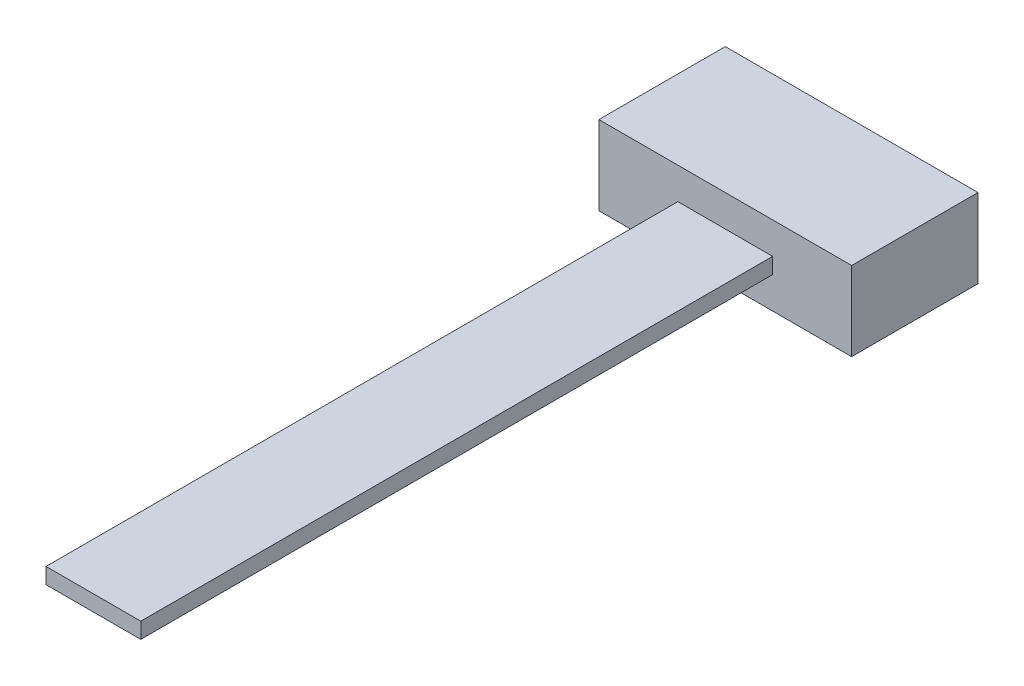
ISO-10303-21;
HEADER;
FILE_DESCRIPTION(('STEP AP214'),'2;1');
FILE_NAME('part.step','',(''),(''),'','','');
FILE_SCHEMA(('AUTOMOTIVE_DESIGN { 1 0 10303 214 1 1 1 1 }'));
ENDSEC;
DATA;
#1=APPLICATION_CONTEXT('core data for automotive mechanical design processes');
#2=APPLICATION_PROTOCOL_DEFINITION('international standard','automotive_design',2000,#1);
#3=PRODUCT_CONTEXT('',#1,'mechanical');
#4=PRODUCT('Part','Part','',(#3));
#5=PRODUCT_RELATED_PRODUCT_CATEGORY('part','',(#4));
#6=PRODUCT_DEFINITION_FORMATION('','',#4);
#7=PRODUCT_DEFINITION_CONTEXT('part definition',#1,'design');
#8=PRODUCT_DEFINITION('design','',#6,#7);
#9=PRODUCT_DEFINITION_SHAPE('','',#8);
#10=(LENGTH_UNIT() NAMED_UNIT(*) SI_UNIT(.MILLI.,.METRE.));
#11=(NAMED_UNIT(*) PLANE_ANGLE_UNIT() SI_UNIT($,.RADIAN.));
#12=(NAMED_UNIT(*) SI_UNIT($,.STERADIAN.) SOLID_ANGLE_UNIT());
#13=UNCERTAINTY_MEASURE_WITH_UNIT(LENGTH_MEASURE(1.E-05),#10,'distance_accuracy_value','');
#14=(GEOMETRIC_REPRESENTATION_CONTEXT(3) GLOBAL_UNCERTAINTY_ASSIGNED_CONTEXT((#13)) GLOBAL_UNIT_ASSIGNED_CONTEXT((#10,
#11,#12)) REPRESENTATION_CONTEXT('',''));
#15=CARTESIAN_POINT('',(0.,0.,0.));
#16=DIRECTION('',(0.,0.,1.));
#17=DIRECTION('',(1.,0.,0.));
#18=AXIS2_PLACEMENT_3D('',#15,#16,#17);
#19=CARTESIAN_POINT('',(-15.,-2.5,200.));
#20=DIRECTION('',(1.,0.,0.));
#21=DIRECTION('',(0.,0.,-1.));
#22=AXIS2_PLACEMENT_3D('',#19,#20,#21);
#23=PLANE('',#22);
#24=DIRECTION('',(0.,-1.,0.));
#25=VECTOR('',#24,1.);
#26=CARTESIAN_POINT('',(-15.,-2.5,0.));
#27=LINE('',#26,#25);
#28=CARTESIAN_POINT('',(-15.,2.5,0.));
#29=VERTEX_POINT('',#28);
#30=CARTESIAN_POINT('',(-15.,-2.5,0.));
#31=VERTEX_POINT('',#30);
#32=EDGE_CURVE('E132',#29,#31,#27,.T.);
#33=ORIENTED_EDGE('',*,*,#32,.T.);
#34=DIRECTION('',(0.,0.,-1.));
#35=VECTOR('',#34,1.);
#36=CARTESIAN_POINT('',(-15.,-2.5,200.));
#37=LINE('',#36,#35);
#38=CARTESIAN_POINT('',(-15.,-2.5,200.));
#39=VERTEX_POINT('',#38);
#40=EDGE_CURVE('E11',#39,#31,#37,.T.);
#41=ORIENTED_EDGE('',*,*,#40,.F.);
#42=DIRECTION('',(0.,-1.,0.));
#43=VECTOR('',#42,1.);
#44=CARTESIAN_POINT('',(-15.,-2.5,200.));
#45=LINE('',#44,#43);
#46=CARTESIAN_POINT('',(-15.,2.5,200.));
#47=VERTEX_POINT('',#46);
#48=EDGE_CURVE('E136',#47,#39,#45,.T.);
#49=ORIENTED_EDGE('',*,*,#48,.F.);
#50=DIRECTION('',(0.,0.,-1.));
#51=VECTOR('',#50,1.);
#52=CARTESIAN_POINT('',(-15.,2.5,200.));
#53=LINE('',#52,#51);
#54=EDGE_CURVE('E144',#47,#29,#53,.T.);
#55=ORIENTED_EDGE('',*,*,#54,.T.);
#56=EDGE_LOOP('',(#33,#41,#49,#55));
#57=FACE_BOUND('',#56,.T.);
#58=ADVANCED_FACE('F33',(#57),#23,.F.);
#59=CARTESIAN_POINT('',(-15.,-2.5,200.));
#60=DIRECTION('',(0.,1.,0.));
#61=DIRECTION('',(0.,0.,1.));
#62=AXIS2_PLACEMENT_3D('',#59,#60,#61);
#63=PLANE('',#62);
#64=DIRECTION('',(1.,0.,0.));
#65=VECTOR('',#64,1.);
#66=CARTESIAN_POINT('',(-15.,-2.5,0.));
#67=LINE('',#66,#65);
#68=CARTESIAN_POINT('',(15.,-2.5,0.));
#69=VERTEX_POINT('',#68);
#70=EDGE_CURVE('E147',#31,#69,#67,.T.);
#71=ORIENTED_EDGE('',*,*,#70,.T.);
#72=DIRECTION('',(0.,0.,-1.));
#73=VECTOR('',#72,1.);
#74=CARTESIAN_POINT('',(15.,-2.5,200.));
#75=LINE('',#74,#73);
#76=CARTESIAN_POINT('',(15.,-2.5,200.));
#77=VERTEX_POINT('',#76);
#78=EDGE_CURVE('E41',#77,#69,#75,.T.);
#79=ORIENTED_EDGE('',*,*,#78,.F.);
#80=DIRECTION('',(1.,0.,0.));
#81=VECTOR('',#80,1.);
#82=CARTESIAN_POINT('',(-15.,-2.5,200.));
#83=LINE('',#82,#81);
#84=EDGE_CURVE('E138',#39,#77,#83,.T.);
#85=ORIENTED_EDGE('',*,*,#84,.F.);
#86=ORIENTED_EDGE('',*,*,#40,.T.);
#87=EDGE_LOOP('',(#71,#79,#85,#86));
#88=FACE_BOUND('',#87,.T.);
#89=ADVANCED_FACE('F167',(#88),#63,.F.);
#90=CARTESIAN_POINT('',(15.,-2.5,200.));
#91=DIRECTION('',(-1.,0.,0.));
#92=DIRECTION('',(0.,-1.,0.));
#93=AXIS2_PLACEMENT_3D('',#90,#91,#92);
#94=PLANE('',#93);
#95=DIRECTION('',(0.,1.,0.));
#96=VECTOR('',#95,1.);
#97=CARTESIAN_POINT('',(15.,-2.5,0.));
#98=LINE('',#97,#96);
#99=CARTESIAN_POINT('',(15.,2.5,0.));
#100=VERTEX_POINT('',#99);
#101=EDGE_CURVE('E150',#69,#100,#98,.T.);
#102=ORIENTED_EDGE('',*,*,#101,.T.);
#103=DIRECTION('',(0.,0.,-1.));
#104=VECTOR('',#103,1.);
#105=CARTESIAN_POINT('',(15.,2.5,200.));
#106=LINE('',#105,#104);
#107=CARTESIAN_POINT('',(15.,2.5,200.));
#108=VERTEX_POINT('',#107);
#109=EDGE_CURVE('E157',#108,#100,#106,.T.);
#110=ORIENTED_EDGE('',*,*,#109,.F.);
#111=DIRECTION('',(0.,1.,0.));
#112=VECTOR('',#111,1.);
#113=CARTESIAN_POINT('',(15.,-2.5,200.));
#114=LINE('',#113,#112);
#115=EDGE_CURVE('E141',#77,#108,#114,.T.);
#116=ORIENTED_EDGE('',*,*,#115,.F.);
#117=ORIENTED_EDGE('',*,*,#78,.T.);
#118=EDGE_LOOP('',(#102,#110,#116,#117));
#119=FACE_BOUND('',#118,.T.);
#120=ADVANCED_FACE('F163',(#119),#94,.F.);
#121=CARTESIAN_POINT('',(-15.,2.5,200.));
#122=DIRECTION('',(0.,-1.,0.));
#123=DIRECTION('',(1.,0.,0.));
#124=AXIS2_PLACEMENT_3D('',#121,#122,#123);
#125=PLANE('',#124);
#126=DIRECTION('',(-1.,0.,0.));
#127=VECTOR('',#126,1.);
#128=CARTESIAN_POINT('',(-15.,2.5,0.));
#129=LINE('',#128,#127);
#130=EDGE_CURVE('E139',#100,#29,#129,.T.);
#131=ORIENTED_EDGE('',*,*,#130,.T.);
#132=ORIENTED_EDGE('',*,*,#54,.F.);
#133=DIRECTION('',(-1.,0.,0.));
#134=VECTOR('',#133,1.);
#135=CARTESIAN_POINT('',(-15.,2.5,200.));
#136=LINE('',#135,#134);
#137=EDGE_CURVE('E48',#108,#47,#136,.T.);
#138=ORIENTED_EDGE('',*,*,#137,.F.);
#139=ORIENTED_EDGE('',*,*,#109,.T.);
#140=EDGE_LOOP('',(#131,#132,#138,#139));
#141=FACE_BOUND('',#140,.T.);
#142=ADVANCED_FACE('F172',(#141),#125,.F.);
#143=CARTESIAN_POINT('',(0.,0.,200.));
#144=DIRECTION('',(0.,0.,-1.));
#145=DIRECTION('',(-1.,0.,0.));
#146=AXIS2_PLACEMENT_3D('',#143,#144,#145);
#147=PLANE('',#146);
#148=ORIENTED_EDGE('',*,*,#48,.T.);
#149=ORIENTED_EDGE('',*,*,#84,.T.);
#150=ORIENTED_EDGE('',*,*,#115,.T.);
#151=ORIENTED_EDGE('',*,*,#137,.T.);
#152=EDGE_LOOP('',(#148,#149,#150,#151));
#153=FACE_BOUND('',#152,.T.);
#154=ADVANCED_FACE('F175',(#153),#147,.F.);
#155=CARTESIAN_POINT('',(0.,0.,0.));
#156=DIRECTION('',(0.,0.,1.));
#157=DIRECTION('',(1.,0.,0.));
#158=AXIS2_PLACEMENT_3D('',#155,#156,#157);
#159=PLANE('',#158);
#160=DIRECTION('',(0.,-1.,0.));
#161=VECTOR('',#160,1.);
#162=CARTESIAN_POINT('',(-40.,12.5,0.));
#163=LINE('',#162,#161);
#164=CARTESIAN_POINT('',(-40.,12.5,0.));
#165=VERTEX_POINT('',#164);
#166=CARTESIAN_POINT('',(-40.,-12.5,0.));
#167=VERTEX_POINT('',#166);
#168=EDGE_CURVE('E126',#165,#167,#163,.T.);
#169=ORIENTED_EDGE('',*,*,#168,.T.);
#170=DIRECTION('',(1.,0.,0.));
#171=VECTOR('',#170,1.);
#172=CARTESIAN_POINT('',(-40.,-12.5,0.));
#173=LINE('',#172,#171);
#174=CARTESIAN_POINT('',(40.,-12.5,0.));
#175=VERTEX_POINT('',#174);
#176=EDGE_CURVE('E98',#167,#175,#173,.T.);
#177=ORIENTED_EDGE('',*,*,#176,.T.);
#178=DIRECTION('',(0.,1.,0.));
#179=VECTOR('',#178,1.);
#180=CARTESIAN_POINT('',(40.,12.5,0.));
#181=LINE('',#180,#179);
#182=CARTESIAN_POINT('',(40.,12.5,0.));
#183=VERTEX_POINT('',#182);
#184=EDGE_CURVE('E121',#175,#183,#181,.T.);
#185=ORIENTED_EDGE('',*,*,#184,.T.);
#186=DIRECTION('',(-1.,0.,0.));
#187=VECTOR('',#186,1.);
#188=CARTESIAN_POINT('',(-40.,12.5,0.));
#189=LINE('',#188,#187);
#190=EDGE_CURVE('E118',#183,#165,#189,.T.);
#191=ORIENTED_EDGE('',*,*,#190,.T.);
#192=EDGE_LOOP('',(#169,#177,#185,#191));
#193=FACE_BOUND('',#192,.T.);
#194=ORIENTED_EDGE('',*,*,#32,.F.);
#195=ORIENTED_EDGE('',*,*,#130,.F.);
#196=ORIENTED_EDGE('',*,*,#101,.F.);
#197=ORIENTED_EDGE('',*,*,#70,.F.);
#198=EDGE_LOOP('',(#194,#195,#196,#197));
#199=FACE_BOUND('',#198,.T.);
#200=ADVANCED_FACE('F170',(#193,#199),#159,.T.);
#201=CARTESIAN_POINT('',(-40.,12.5,-40.));
#202=DIRECTION('',(-1.,0.,0.));
#203=DIRECTION('',(0.,0.,1.));
#204=AXIS2_PLACEMENT_3D('',#201,#202,#203);
#205=PLANE('',#204);
#206=ORIENTED_EDGE('',*,*,#168,.F.);
#207=DIRECTION('',(0.,0.,1.));
#208=VECTOR('',#207,1.);
#209=CARTESIAN_POINT('',(-40.,12.5,-40.));
#210=LINE('',#209,#208);
#211=CARTESIAN_POINT('',(-40.,12.5,-40.));
#212=VERTEX_POINT('',#211);
#213=EDGE_CURVE('E117',#212,#165,#210,.T.);
#214=ORIENTED_EDGE('',*,*,#213,.F.);
#215=DIRECTION('',(0.,-1.,0.));
#216=VECTOR('',#215,1.);
#217=CARTESIAN_POINT('',(-40.,12.5,-40.));
#218=LINE('',#217,#216);
#219=CARTESIAN_POINT('',(-40.,-12.5,-40.));
#220=VERTEX_POINT('',#219);
#221=EDGE_CURVE('E111',#212,#220,#218,.T.);
#222=ORIENTED_EDGE('',*,*,#221,.T.);
#223=DIRECTION('',(0.,0.,1.));
#224=VECTOR('',#223,1.);
#225=CARTESIAN_POINT('',(-40.,-12.5,-40.));
#226=LINE('',#225,#224);
#227=EDGE_CURVE('E93',#220,#167,#226,.T.);
#228=ORIENTED_EDGE('',*,*,#227,.T.);
#229=EDGE_LOOP('',(#206,#214,#222,#228));
#230=FACE_BOUND('',#229,.T.);
#231=ADVANCED_FACE('F116',(#230),#205,.T.);
#232=CARTESIAN_POINT('',(-40.,12.5,-40.));
#233=DIRECTION('',(0.,1.,0.));
#234=DIRECTION('',(0.,0.,1.));
#235=AXIS2_PLACEMENT_3D('',#232,#233,#234);
#236=PLANE('',#235);
#237=ORIENTED_EDGE('',*,*,#190,.F.);
#238=DIRECTION('',(0.,0.,1.));
#239=VECTOR('',#238,1.);
#240=CARTESIAN_POINT('',(40.,12.5,-40.));
#241=LINE('',#240,#239);
#242=CARTESIAN_POINT('',(40.,12.5,-40.));
#243=VERTEX_POINT('',#242);
#244=EDGE_CURVE('E133',#243,#183,#241,.T.);
#245=ORIENTED_EDGE('',*,*,#244,.F.);
#246=DIRECTION('',(-1.,0.,0.));
#247=VECTOR('',#246,1.);
#248=CARTESIAN_POINT('',(-40.,12.5,-40.));
#249=LINE('',#248,#247);
#250=EDGE_CURVE('E104',#243,#212,#249,.T.);
#251=ORIENTED_EDGE('',*,*,#250,.T.);
#252=ORIENTED_EDGE('',*,*,#213,.T.);
#253=EDGE_LOOP('',(#237,#245,#251,#252));
#254=FACE_BOUND('',#253,.T.);
#255=ADVANCED_FACE('F216',(#254),#236,.T.);
#256=CARTESIAN_POINT('',(40.,12.5,-40.));
#257=DIRECTION('',(1.,0.,0.));
#258=DIRECTION('',(0.,0.,-1.));
#259=AXIS2_PLACEMENT_3D('',#256,#257,#258);
#260=PLANE('',#259);
#261=ORIENTED_EDGE('',*,*,#184,.F.);
#262=DIRECTION('',(0.,0.,1.));
#263=VECTOR('',#262,1.);
#264=CARTESIAN_POINT('',(40.,-12.5,-40.));
#265=LINE('',#264,#263);
#266=CARTESIAN_POINT('',(40.,-12.5,-40.));
#267=VERTEX_POINT('',#266);
#268=EDGE_CURVE('E103',#267,#175,#265,.T.);
#269=ORIENTED_EDGE('',*,*,#268,.F.);
#270=DIRECTION('',(0.,1.,0.));
#271=VECTOR('',#270,1.);
#272=CARTESIAN_POINT('',(40.,12.5,-40.));
#273=LINE('',#272,#271);
#274=EDGE_CURVE('E114',#267,#243,#273,.T.);
#275=ORIENTED_EDGE('',*,*,#274,.T.);
#276=ORIENTED_EDGE('',*,*,#244,.T.);
#277=EDGE_LOOP('',(#261,#269,#275,#276));
#278=FACE_BOUND('',#277,.T.);
#279=ADVANCED_FACE('F224',(#278),#260,.T.);
#280=CARTESIAN_POINT('',(-40.,-12.5,-40.));
#281=DIRECTION('',(0.,-1.,0.));
#282=DIRECTION('',(0.,0.,-1.));
#283=AXIS2_PLACEMENT_3D('',#280,#281,#282);
#284=PLANE('',#283);
#285=ORIENTED_EDGE('',*,*,#176,.F.);
#286=ORIENTED_EDGE('',*,*,#227,.F.);
#287=DIRECTION('',(1.,0.,0.));
#288=VECTOR('',#287,1.);
#289=CARTESIAN_POINT('',(-40.,-12.5,-40.));
#290=LINE('',#289,#288);
#291=EDGE_CURVE('E96',#220,#267,#290,.T.);
#292=ORIENTED_EDGE('',*,*,#291,.T.);
#293=ORIENTED_EDGE('',*,*,#268,.T.);
#294=EDGE_LOOP('',(#285,#286,#292,#293));
#295=FACE_BOUND('',#294,.T.);
#296=ADVANCED_FACE('F95',(#295),#284,.T.);
#297=CARTESIAN_POINT('',(0.,0.,-40.));
#298=DIRECTION('',(0.,0.,1.));
#299=DIRECTION('',(1.,0.,0.));
#300=AXIS2_PLACEMENT_3D('',#297,#298,#299);
#301=PLANE('',#300);
#302=ORIENTED_EDGE('',*,*,#221,.F.);
#303=ORIENTED_EDGE('',*,*,#250,.F.);
#304=ORIENTED_EDGE('',*,*,#274,.F.);
#305=ORIENTED_EDGE('',*,*,#291,.F.);
#306=EDGE_LOOP('',(#302,#303,#304,#305));
#307=FACE_BOUND('',#306,.T.);
#308=ADVANCED_FACE('F109',(#307),#301,.F.);
#309=CLOSED_SHELL('',(#58,#89,#120,#142,#154,#200,#231,#255,#279,#296,#308));
#310=MANIFOLD_SOLID_BREP('B2',#309);
#311=ADVANCED_BREP_SHAPE_REPRESENTATION('',(#18,#310),#14);
#312=SHAPE_DEFINITION_REPRESENTATION(#9,#311);
ENDSEC;
END-ISO-10303-21;
